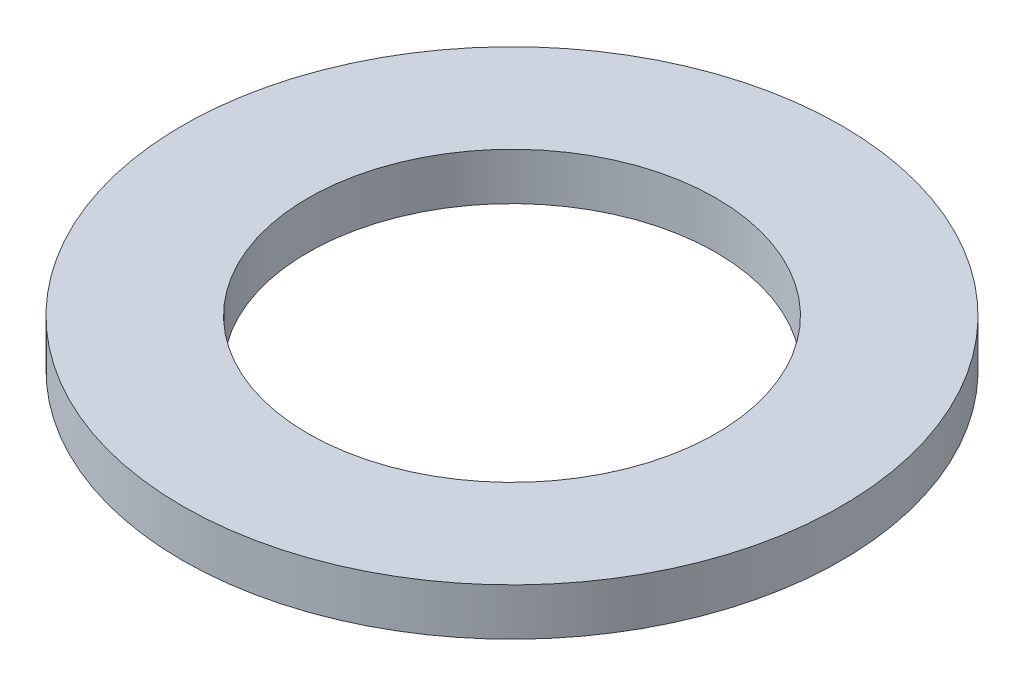
ISO-10303-21;
HEADER;
FILE_DESCRIPTION(('STEP AP214'),'2;1');
FILE_NAME('part.step','',(''),(''),'','','');
FILE_SCHEMA(('AUTOMOTIVE_DESIGN { 1 0 10303 214 1 1 1 1 }'));
ENDSEC;
DATA;
#1=APPLICATION_CONTEXT('core data for automotive mechanical design processes');
#2=APPLICATION_PROTOCOL_DEFINITION('international standard','automotive_design',2000,#1);
#3=PRODUCT_CONTEXT('',#1,'mechanical');
#4=PRODUCT('Part','Part','',(#3));
#5=PRODUCT_RELATED_PRODUCT_CATEGORY('part','',(#4));
#6=PRODUCT_DEFINITION_FORMATION('','',#4);
#7=PRODUCT_DEFINITION_CONTEXT('part definition',#1,'design');
#8=PRODUCT_DEFINITION('design','',#6,#7);
#9=PRODUCT_DEFINITION_SHAPE('','',#8);
#10=(LENGTH_UNIT() NAMED_UNIT(*) SI_UNIT(.MILLI.,.METRE.));
#11=(NAMED_UNIT(*) PLANE_ANGLE_UNIT() SI_UNIT($,.RADIAN.));
#12=(NAMED_UNIT(*) SI_UNIT($,.STERADIAN.) SOLID_ANGLE_UNIT());
#13=UNCERTAINTY_MEASURE_WITH_UNIT(LENGTH_MEASURE(1.E-05),#10,'distance_accuracy_value','');
#14=(GEOMETRIC_REPRESENTATION_CONTEXT(3) GLOBAL_UNCERTAINTY_ASSIGNED_CONTEXT((#13)) GLOBAL_UNIT_ASSIGNED_CONTEXT((#10,
#11,#12)) REPRESENTATION_CONTEXT('',''));
#15=CARTESIAN_POINT('',(0.,0.,0.));
#16=DIRECTION('',(0.,0.,1.));
#17=DIRECTION('',(1.,0.,0.));
#18=AXIS2_PLACEMENT_3D('',#15,#16,#17);
#19=CARTESIAN_POINT('',(0.,1.5,0.));
#20=DIRECTION('',(0.,1.,0.));
#21=DIRECTION('',(0.,0.,1.));
#22=AXIS2_PLACEMENT_3D('',#19,#20,#21);
#23=PLANE('',#22);
#24=CARTESIAN_POINT('',(0.,1.5,0.));
#25=DIRECTION('',(0.,1.,0.));
#26=DIRECTION('',(0.,0.,1.));
#27=AXIS2_PLACEMENT_3D('',#24,#25,#26);
#28=CIRCLE('',#27,10.5);
#29=CARTESIAN_POINT('',(0.,1.5,10.5));
#30=VERTEX_POINT('',#29);
#31=EDGE_CURVE('E10',#30,#30,#28,.T.);
#32=ORIENTED_EDGE('',*,*,#31,.T.);
#33=EDGE_LOOP('',(#32));
#34=FACE_BOUND('',#33,.T.);
#35=CARTESIAN_POINT('',(0.,1.5,0.));
#36=DIRECTION('',(0.,1.,0.));
#37=DIRECTION('',(0.,0.,1.));
#38=AXIS2_PLACEMENT_3D('',#35,#36,#37);
#39=CIRCLE('',#38,6.5);
#40=CARTESIAN_POINT('',(0.,1.5,6.5));
#41=VERTEX_POINT('',#40);
#42=EDGE_CURVE('E42',#41,#41,#39,.T.);
#43=ORIENTED_EDGE('',*,*,#42,.F.);
#44=EDGE_LOOP('',(#43));
#45=FACE_BOUND('',#44,.T.);
#46=ADVANCED_FACE('F31',(#34,#45),#23,.T.);
#47=CARTESIAN_POINT('',(0.,0.,0.));
#48=DIRECTION('',(0.,1.,0.));
#49=DIRECTION('',(0.,0.,1.));
#50=AXIS2_PLACEMENT_3D('',#47,#48,#49);
#51=PLANE('',#50);
#52=CARTESIAN_POINT('',(0.,0.,0.));
#53=DIRECTION('',(0.,1.,0.));
#54=DIRECTION('',(0.,0.,1.));
#55=AXIS2_PLACEMENT_3D('',#52,#53,#54);
#56=CIRCLE('',#55,10.5);
#57=CARTESIAN_POINT('',(0.,0.,10.5));
#58=VERTEX_POINT('',#57);
#59=EDGE_CURVE('E35',#58,#58,#56,.T.);
#60=ORIENTED_EDGE('',*,*,#59,.F.);
#61=EDGE_LOOP('',(#60));
#62=FACE_BOUND('',#61,.T.);
#63=CARTESIAN_POINT('',(0.,0.,0.));
#64=DIRECTION('',(0.,1.,0.));
#65=DIRECTION('',(0.,0.,1.));
#66=AXIS2_PLACEMENT_3D('',#63,#64,#65);
#67=CIRCLE('',#66,6.5);
#68=CARTESIAN_POINT('',(0.,0.,6.5));
#69=VERTEX_POINT('',#68);
#70=EDGE_CURVE('E44',#69,#69,#67,.T.);
#71=ORIENTED_EDGE('',*,*,#70,.T.);
#72=EDGE_LOOP('',(#71));
#73=FACE_BOUND('',#72,.T.);
#74=ADVANCED_FACE('F54',(#62,#73),#51,.F.);
#75=CARTESIAN_POINT('',(0.,1.5,0.));
#76=DIRECTION('',(0.,-1.,0.));
#77=DIRECTION('',(0.,0.,-1.));
#78=AXIS2_PLACEMENT_3D('',#75,#76,#77);
#79=CYLINDRICAL_SURFACE('',#78,10.5);
#80=ORIENTED_EDGE('',*,*,#31,.F.);
#81=EDGE_LOOP('',(#80));
#82=FACE_BOUND('',#81,.T.);
#83=ORIENTED_EDGE('',*,*,#59,.T.);
#84=EDGE_LOOP('',(#83));
#85=FACE_BOUND('',#84,.T.);
#86=ADVANCED_FACE('F33',(#82,#85),#79,.T.);
#87=CARTESIAN_POINT('',(0.,1.5,0.));
#88=DIRECTION('',(0.,-1.,0.));
#89=DIRECTION('',(0.,0.,-1.));
#90=AXIS2_PLACEMENT_3D('',#87,#88,#89);
#91=CYLINDRICAL_SURFACE('',#90,6.5);
#92=ORIENTED_EDGE('',*,*,#42,.T.);
#93=EDGE_LOOP('',(#92));
#94=FACE_BOUND('',#93,.T.);
#95=ORIENTED_EDGE('',*,*,#70,.F.);
#96=EDGE_LOOP('',(#95));
#97=FACE_BOUND('',#96,.T.);
#98=ADVANCED_FACE('F50',(#94,#97),#91,.F.);
#99=CLOSED_SHELL('',(#46,#74,#86,#98));
#100=MANIFOLD_SOLID_BREP('B2',#99);
#101=ADVANCED_BREP_SHAPE_REPRESENTATION('',(#18,#100),#14);
#102=SHAPE_DEFINITION_REPRESENTATION(#9,#101);
ENDSEC;
END-ISO-10303-21;
